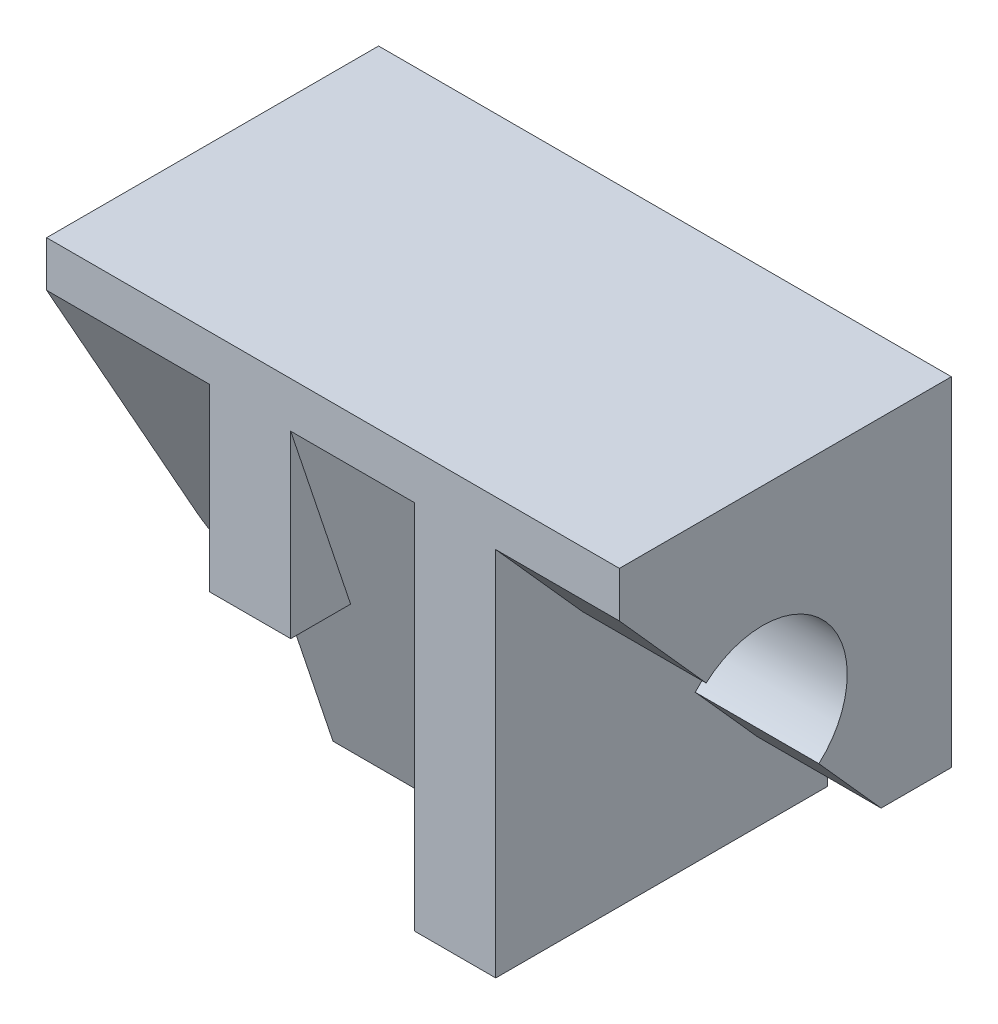
ISO-10303-21;
HEADER;
FILE_DESCRIPTION(('STEP AP214'),'2;1');
FILE_NAME('part.step','',(''),(''),'','','');
FILE_SCHEMA(('AUTOMOTIVE_DESIGN { 1 0 10303 214 1 1 1 1 }'));
ENDSEC;
DATA;
#1=APPLICATION_CONTEXT('core data for automotive mechanical design processes');
#2=APPLICATION_PROTOCOL_DEFINITION('international standard','automotive_design',2000,#1);
#3=PRODUCT_CONTEXT('',#1,'mechanical');
#4=PRODUCT('Part','Part','',(#3));
#5=PRODUCT_RELATED_PRODUCT_CATEGORY('part','',(#4));
#6=PRODUCT_DEFINITION_FORMATION('','',#4);
#7=PRODUCT_DEFINITION_CONTEXT('part definition',#1,'design');
#8=PRODUCT_DEFINITION('design','',#6,#7);
#9=PRODUCT_DEFINITION_SHAPE('','',#8);
#10=(LENGTH_UNIT() NAMED_UNIT(*) SI_UNIT(.MILLI.,.METRE.));
#11=(NAMED_UNIT(*) PLANE_ANGLE_UNIT() SI_UNIT($,.RADIAN.));
#12=(NAMED_UNIT(*) SI_UNIT($,.STERADIAN.) SOLID_ANGLE_UNIT());
#13=UNCERTAINTY_MEASURE_WITH_UNIT(LENGTH_MEASURE(1.E-05),#10,'distance_accuracy_value','');
#14=(GEOMETRIC_REPRESENTATION_CONTEXT(3) GLOBAL_UNCERTAINTY_ASSIGNED_CONTEXT((#13)) GLOBAL_UNIT_ASSIGNED_CONTEXT((#10,
#11,#12)) REPRESENTATION_CONTEXT('',''));
#15=CARTESIAN_POINT('',(0.,0.,0.));
#16=DIRECTION('',(0.,0.,1.));
#17=DIRECTION('',(1.,0.,0.));
#18=AXIS2_PLACEMENT_3D('',#15,#16,#17);
#19=CARTESIAN_POINT('',(-17.3125,2.69270833333333,25.5));
#20=DIRECTION('',(1.,0.,0.));
#21=DIRECTION('',(0.,1.,0.));
#22=AXIS2_PLACEMENT_3D('',#19,#20,#21);
#23=PLANE('',#22);
#24=DIRECTION('',(0.,-1.,0.));
#25=VECTOR('',#24,1.);
#26=CARTESIAN_POINT('',(-17.3125,2.69270833333333,0.));
#27=LINE('',#26,#25);
#28=CARTESIAN_POINT('',(-17.3125,2.69270833333333,0.));
#29=VERTEX_POINT('',#28);
#30=CARTESIAN_POINT('',(-17.3125,-21.3072916666667,0.));
#31=VERTEX_POINT('',#30);
#32=EDGE_CURVE('E173',#29,#31,#27,.T.);
#33=ORIENTED_EDGE('',*,*,#32,.T.);
#34=DIRECTION('',(0.,0.,-1.));
#35=VECTOR('',#34,1.);
#36=CARTESIAN_POINT('',(-17.3125,-21.3072916666667,25.5));
#37=LINE('',#36,#35);
#38=CARTESIAN_POINT('',(-17.3125,-21.3072916666667,13.9912280701754));
#39=VERTEX_POINT('',#38);
#40=EDGE_CURVE('E48',#31,#39,#37,.F.);
#41=ORIENTED_EDGE('',*,*,#40,.T.);
#42=DIRECTION('',(0.,0.871983785385481,0.489534756707639));
#43=VECTOR('',#42,1.);
#44=CARTESIAN_POINT('',(-17.3125,-40.1518979356792,3.41179998932631));
#45=LINE('',#44,#43);
#46=CARTESIAN_POINT('',(-17.3125,-0.80729166666667,25.5));
#47=VERTEX_POINT('',#46);
#48=EDGE_CURVE('E182',#39,#47,#45,.T.);
#49=ORIENTED_EDGE('',*,*,#48,.T.);
#50=DIRECTION('',(0.,-1.,0.));
#51=VECTOR('',#50,1.);
#52=CARTESIAN_POINT('',(-17.3125,2.69270833333333,25.5));
#53=LINE('',#52,#51);
#54=CARTESIAN_POINT('',(-17.3125,2.69270833333333,25.5));
#55=VERTEX_POINT('',#54);
#56=EDGE_CURVE('E177',#55,#47,#53,.T.);
#57=ORIENTED_EDGE('',*,*,#56,.F.);
#58=DIRECTION('',(0.,0.,-1.));
#59=VECTOR('',#58,1.);
#60=CARTESIAN_POINT('',(-17.3125,2.69270833333333,25.5));
#61=LINE('',#60,#59);
#62=EDGE_CURVE('E187',#55,#29,#61,.T.);
#63=ORIENTED_EDGE('',*,*,#62,.T.);
#64=EDGE_LOOP('',(#33,#41,#49,#57,#63));
#65=FACE_BOUND('',#64,.T.);
#66=ADVANCED_FACE('F39',(#65),#23,.F.);
#67=CARTESIAN_POINT('',(0.,0.,25.5));
#68=DIRECTION('',(0.,0.,1.));
#69=DIRECTION('',(1.,0.,0.));
#70=AXIS2_PLACEMENT_3D('',#67,#68,#69);
#71=PLANE('',#70);
#72=DIRECTION('',(0.,1.,0.));
#73=VECTOR('',#72,1.);
#74=CARTESIAN_POINT('',(-4.8125,-29.3072916666667,25.5));
#75=LINE('',#74,#73);
#76=CARTESIAN_POINT('',(-4.8125,-14.6098867790321,25.5));
#77=VERTEX_POINT('',#76);
#78=CARTESIAN_POINT('',(-4.8125,-0.80729166666667,25.5));
#79=VERTEX_POINT('',#78);
#80=EDGE_CURVE('E151',#77,#79,#75,.T.);
#81=ORIENTED_EDGE('',*,*,#80,.F.);
#82=DIRECTION('',(1.,0.,0.));
#83=VECTOR('',#82,1.);
#84=CARTESIAN_POINT('',(0.,-14.6098867790321,25.5));
#85=LINE('',#84,#83);
#86=CARTESIAN_POINT('',(1.4375,-14.6098867790321,25.5));
#87=VERTEX_POINT('',#86);
#88=EDGE_CURVE('E246',#77,#87,#85,.T.);
#89=ORIENTED_EDGE('',*,*,#88,.T.);
#90=DIRECTION('',(0.,1.,0.));
#91=VECTOR('',#90,1.);
#92=CARTESIAN_POINT('',(1.4375,0.,25.5));
#93=LINE('',#92,#91);
#94=CARTESIAN_POINT('',(1.4375,-0.80729166666667,25.5));
#95=VERTEX_POINT('',#94);
#96=EDGE_CURVE('E250',#87,#95,#93,.T.);
#97=ORIENTED_EDGE('',*,*,#96,.T.);
#98=DIRECTION('',(-1.,0.,0.));
#99=VECTOR('',#98,1.);
#100=CARTESIAN_POINT('',(0.,-0.807291666666703,25.5));
#101=LINE('',#100,#99);
#102=CARTESIAN_POINT('',(10.9375,-0.807291666666704,25.5));
#103=VERTEX_POINT('',#102);
#104=EDGE_CURVE('E261',#103,#95,#101,.T.);
#105=ORIENTED_EDGE('',*,*,#104,.F.);
#106=DIRECTION('',(0.,-1.,0.));
#107=VECTOR('',#106,1.);
#108=CARTESIAN_POINT('',(10.9375,0.,25.5));
#109=LINE('',#108,#107);
#110=CARTESIAN_POINT('',(10.9375,-29.3072916666667,25.5));
#111=VERTEX_POINT('',#110);
#112=EDGE_CURVE('E255',#103,#111,#109,.T.);
#113=ORIENTED_EDGE('',*,*,#112,.T.);
#114=DIRECTION('',(1.,0.,0.));
#115=VECTOR('',#114,1.);
#116=CARTESIAN_POINT('',(-4.8125,-29.3072916666667,25.5));
#117=LINE('',#116,#115);
#118=CARTESIAN_POINT('',(17.1875,-29.3072916666667,25.5));
#119=VERTEX_POINT('',#118);
#120=EDGE_CURVE('E287',#111,#119,#117,.T.);
#121=ORIENTED_EDGE('',*,*,#120,.T.);
#122=DIRECTION('',(0.,1.,0.));
#123=VECTOR('',#122,1.);
#124=CARTESIAN_POINT('',(17.1875,2.69270833333333,25.5));
#125=LINE('',#124,#123);
#126=CARTESIAN_POINT('',(17.1875,-0.807291666666666,25.5));
#127=VERTEX_POINT('',#126);
#128=EDGE_CURVE('E290',#119,#127,#125,.T.);
#129=ORIENTED_EDGE('',*,*,#128,.T.);
#130=DIRECTION('',(1.,0.,0.));
#131=VECTOR('',#130,1.);
#132=CARTESIAN_POINT('',(17.1875,-0.807291666666666,25.5));
#133=LINE('',#132,#131);
#134=CARTESIAN_POINT('',(26.6875,-0.807291666666665,25.5));
#135=VERTEX_POINT('',#134);
#136=EDGE_CURVE('E214',#127,#135,#133,.T.);
#137=ORIENTED_EDGE('',*,*,#136,.T.);
#138=DIRECTION('',(0.,1.,0.));
#139=VECTOR('',#138,1.);
#140=CARTESIAN_POINT('',(26.6875,2.69270833333333,25.5));
#141=LINE('',#140,#139);
#142=CARTESIAN_POINT('',(26.6875,2.69270833333333,25.5));
#143=VERTEX_POINT('',#142);
#144=EDGE_CURVE('E225',#135,#143,#141,.T.);
#145=ORIENTED_EDGE('',*,*,#144,.T.);
#146=DIRECTION('',(-1.,0.,0.));
#147=VECTOR('',#146,1.);
#148=CARTESIAN_POINT('',(-4.81250000000001,2.69270833333333,25.5));
#149=LINE('',#148,#147);
#150=EDGE_CURVE('E294',#143,#55,#149,.T.);
#151=ORIENTED_EDGE('',*,*,#150,.T.);
#152=ORIENTED_EDGE('',*,*,#56,.T.);
#153=DIRECTION('',(-1.,0.,0.));
#154=VECTOR('',#153,1.);
#155=CARTESIAN_POINT('',(-4.8125,-0.80729166666667,25.5));
#156=LINE('',#155,#154);
#157=EDGE_CURVE('E163',#79,#47,#156,.T.);
#158=ORIENTED_EDGE('',*,*,#157,.F.);
#159=EDGE_LOOP('',(#81,#89,#97,#105,#113,#121,#129,#137,#145,#151,#152,#158));
#160=FACE_BOUND('',#159,.T.);
#161=ADVANCED_FACE('F175',(#160),#71,.T.);
#162=CARTESIAN_POINT('',(17.1875,-23.3072916666667,25.5));
#163=DIRECTION('',(0.,1.,0.));
#164=DIRECTION('',(0.,0.,1.));
#165=AXIS2_PLACEMENT_3D('',#162,#163,#164);
#166=PLANE('',#165);
#167=DIRECTION('',(1.,0.,0.));
#168=VECTOR('',#167,1.);
#169=CARTESIAN_POINT('',(17.1875,-23.3072916666667,5.39999999999999));
#170=LINE('',#169,#168);
#171=CARTESIAN_POINT('',(17.1875,-23.3072916666667,5.39999999999999));
#172=VERTEX_POINT('',#171);
#173=CARTESIAN_POINT('',(26.6875,-23.3072916666667,5.39999999999999));
#174=VERTEX_POINT('',#173);
#175=EDGE_CURVE('E210',#172,#174,#170,.T.);
#176=ORIENTED_EDGE('',*,*,#175,.F.);
#177=DIRECTION('',(0.,0.,-1.));
#178=VECTOR('',#177,1.);
#179=CARTESIAN_POINT('',(17.1875,-23.3072916666667,25.5));
#180=LINE('',#179,#178);
#181=CARTESIAN_POINT('',(17.1875,-23.3072916666667,0.));
#182=VERTEX_POINT('',#181);
#183=EDGE_CURVE('E242',#172,#182,#180,.T.);
#184=ORIENTED_EDGE('',*,*,#183,.T.);
#185=DIRECTION('',(1.,0.,0.));
#186=VECTOR('',#185,1.);
#187=CARTESIAN_POINT('',(17.1875,-23.3072916666667,0.));
#188=LINE('',#187,#186);
#189=CARTESIAN_POINT('',(26.6875,-23.3072916666667,0.));
#190=VERTEX_POINT('',#189);
#191=EDGE_CURVE('E213',#182,#190,#188,.T.);
#192=ORIENTED_EDGE('',*,*,#191,.T.);
#193=DIRECTION('',(0.,0.,-1.));
#194=VECTOR('',#193,1.);
#195=CARTESIAN_POINT('',(26.6875,-23.3072916666667,25.5));
#196=LINE('',#195,#194);
#197=EDGE_CURVE('E239',#174,#190,#196,.T.);
#198=ORIENTED_EDGE('',*,*,#197,.F.);
#199=EDGE_LOOP('',(#176,#184,#192,#198));
#200=FACE_BOUND('',#199,.T.);
#201=ADVANCED_FACE('F368',(#200),#166,.F.);
#202=CARTESIAN_POINT('',(26.6875,2.69270833333333,25.5));
#203=DIRECTION('',(-1.,0.,0.));
#204=DIRECTION('',(0.,-1.,0.));
#205=AXIS2_PLACEMENT_3D('',#202,#203,#204);
#206=PLANE('',#205);
#207=DIRECTION('',(0.,-0.745761207441643,-0.666213345314534));
#208=VECTOR('',#207,1.);
#209=CARTESIAN_POINT('',(26.6875,-13.0276282669237,14.583165970437));
#210=LINE('',#209,#208);
#211=CARTESIAN_POINT('',(26.6875,-17.9606969535699,10.1762912770331));
#212=VERTEX_POINT('',#211);
#213=EDGE_CURVE('E193',#212,#174,#210,.T.);
#214=ORIENTED_EDGE('',*,*,#213,.T.);
#215=ORIENTED_EDGE('',*,*,#197,.T.);
#216=DIRECTION('',(0.,1.,0.));
#217=VECTOR('',#216,1.);
#218=CARTESIAN_POINT('',(26.6875,2.69270833333333,0.));
#219=LINE('',#218,#217);
#220=CARTESIAN_POINT('',(26.6875,2.69270833333333,0.));
#221=VERTEX_POINT('',#220);
#222=EDGE_CURVE('E229',#190,#221,#219,.T.);
#223=ORIENTED_EDGE('',*,*,#222,.T.);
#224=DIRECTION('',(0.,0.,-1.));
#225=VECTOR('',#224,1.);
#226=CARTESIAN_POINT('',(26.6875,2.69270833333333,25.5));
#227=LINE('',#226,#225);
#228=EDGE_CURVE('E228',#143,#221,#227,.T.);
#229=ORIENTED_EDGE('',*,*,#228,.F.);
#230=ORIENTED_EDGE('',*,*,#144,.F.);
#231=CARTESIAN_POINT('',(26.6875,-8.26581044541502,18.8370565576515));
#232=VERTEX_POINT('',#231);
#233=EDGE_CURVE('E198',#135,#232,#210,.T.);
#234=ORIENTED_EDGE('',*,*,#233,.T.);
#235=CARTESIAN_POINT('',(26.6875,-13.1072916666667,14.5));
#236=DIRECTION('',(1.,0.,0.));
#237=DIRECTION('',(0.,1.,0.));
#238=AXIS2_PLACEMENT_3D('',#235,#236,#237);
#239=CIRCLE('',#238,6.5);
#240=EDGE_CURVE('E206',#212,#232,#239,.T.);
#241=ORIENTED_EDGE('',*,*,#240,.F.);
#242=EDGE_LOOP('',(#214,#215,#223,#229,#230,#234,#241));
#243=FACE_BOUND('',#242,.T.);
#244=ADVANCED_FACE('F382',(#243),#206,.F.);
#245=CARTESIAN_POINT('',(17.1875,2.69270833333333,25.5));
#246=DIRECTION('',(-1.,0.,0.));
#247=DIRECTION('',(0.,-1.,0.));
#248=AXIS2_PLACEMENT_3D('',#245,#246,#247);
#249=PLANE('',#248);
#250=ORIENTED_EDGE('',*,*,#183,.F.);
#251=DIRECTION('',(0.,-0.745761207441643,-0.666213345314534));
#252=VECTOR('',#251,1.);
#253=CARTESIAN_POINT('',(17.1875,-13.0276282669237,14.583165970437));
#254=LINE('',#253,#252);
#255=CARTESIAN_POINT('',(17.1875,-17.9606969535699,10.1762912770331));
#256=VERTEX_POINT('',#255);
#257=EDGE_CURVE('E194',#256,#172,#254,.T.);
#258=ORIENTED_EDGE('',*,*,#257,.F.);
#259=CARTESIAN_POINT('',(17.1875,-13.1072916666667,14.5));
#260=DIRECTION('',(1.,0.,0.));
#261=DIRECTION('',(0.,1.,0.));
#262=AXIS2_PLACEMENT_3D('',#259,#260,#261);
#263=CIRCLE('',#262,6.5);
#264=CARTESIAN_POINT('',(17.1875,-8.26581044541502,18.8370565576515));
#265=VERTEX_POINT('',#264);
#266=EDGE_CURVE('E197',#256,#265,#263,.T.);
#267=ORIENTED_EDGE('',*,*,#266,.T.);
#268=EDGE_CURVE('E199',#127,#265,#254,.T.);
#269=ORIENTED_EDGE('',*,*,#268,.F.);
#270=ORIENTED_EDGE('',*,*,#128,.F.);
#271=DIRECTION('',(0.,0.,-1.));
#272=VECTOR('',#271,1.);
#273=CARTESIAN_POINT('',(17.1875,-29.3072916666667,25.5));
#274=LINE('',#273,#272);
#275=CARTESIAN_POINT('',(17.1875,-29.3072916666667,0.));
#276=VERTEX_POINT('',#275);
#277=EDGE_CURVE('E297',#119,#276,#274,.T.);
#278=ORIENTED_EDGE('',*,*,#277,.T.);
#279=DIRECTION('',(0.,1.,0.));
#280=VECTOR('',#279,1.);
#281=CARTESIAN_POINT('',(17.1875,2.69270833333333,0.));
#282=LINE('',#281,#280);
#283=EDGE_CURVE('E300',#276,#182,#282,.T.);
#284=ORIENTED_EDGE('',*,*,#283,.T.);
#285=EDGE_LOOP('',(#250,#258,#267,#269,#270,#278,#284));
#286=FACE_BOUND('',#285,.T.);
#287=ADVANCED_FACE('F334',(#286),#249,.F.);
#288=CARTESIAN_POINT('',(-4.8125,-29.3072916666667,25.5));
#289=DIRECTION('',(0.,1.,0.));
#290=DIRECTION('',(0.,0.,1.));
#291=AXIS2_PLACEMENT_3D('',#288,#289,#290);
#292=PLANE('',#291);
#293=DIRECTION('',(-1.,0.,0.));
#294=VECTOR('',#293,1.);
#295=CARTESIAN_POINT('',(-4.8125,-29.3072916666667,9.49999999999999));
#296=LINE('',#295,#294);
#297=CARTESIAN_POINT('',(-4.8125,-29.3072916666667,9.49999999999999));
#298=VERTEX_POINT('',#297);
#299=CARTESIAN_POINT('',(-9.3125,-29.3072916666667,9.49999999999999));
#300=VERTEX_POINT('',#299);
#301=EDGE_CURVE('E170',#298,#300,#296,.T.);
#302=ORIENTED_EDGE('',*,*,#301,.T.);
#303=DIRECTION('',(0.,0.,-1.));
#304=VECTOR('',#303,1.);
#305=CARTESIAN_POINT('',(-9.3125,-29.3072916666667,25.5));
#306=LINE('',#305,#304);
#307=CARTESIAN_POINT('',(-9.3125,-29.3072916666667,0.));
#308=VERTEX_POINT('',#307);
#309=EDGE_CURVE('E309',#300,#308,#306,.T.);
#310=ORIENTED_EDGE('',*,*,#309,.T.);
#311=DIRECTION('',(1.,0.,0.));
#312=VECTOR('',#311,1.);
#313=CARTESIAN_POINT('',(-4.8125,-29.3072916666667,0.));
#314=LINE('',#313,#312);
#315=EDGE_CURVE('E259',#308,#276,#314,.T.);
#316=ORIENTED_EDGE('',*,*,#315,.T.);
#317=ORIENTED_EDGE('',*,*,#277,.F.);
#318=ORIENTED_EDGE('',*,*,#120,.F.);
#319=DIRECTION('',(0.,0.,1.));
#320=VECTOR('',#319,1.);
#321=CARTESIAN_POINT('',(10.9375,-29.3072916666667,-12.6931327817518));
#322=LINE('',#321,#320);
#323=CARTESIAN_POINT('',(10.9375,-29.3072916666667,16.));
#324=VERTEX_POINT('',#323);
#325=EDGE_CURVE('E260',#324,#111,#322,.T.);
#326=ORIENTED_EDGE('',*,*,#325,.F.);
#327=DIRECTION('',(1.,0.,0.));
#328=VECTOR('',#327,1.);
#329=CARTESIAN_POINT('',(0.,-29.3072916666667,16.));
#330=LINE('',#329,#328);
#331=CARTESIAN_POINT('',(-4.8125,-29.3072916666667,16.));
#332=VERTEX_POINT('',#331);
#333=EDGE_CURVE('E275',#332,#324,#330,.T.);
#334=ORIENTED_EDGE('',*,*,#333,.F.);
#335=DIRECTION('',(0.,0.,1.));
#336=VECTOR('',#335,1.);
#337=CARTESIAN_POINT('',(-4.8125,-29.3072916666667,-15.9051549273522));
#338=LINE('',#337,#336);
#339=EDGE_CURVE('E179',#298,#332,#338,.T.);
#340=ORIENTED_EDGE('',*,*,#339,.F.);
#341=EDGE_LOOP('',(#302,#310,#316,#317,#318,#326,#334,#340));
#342=FACE_BOUND('',#341,.T.);
#343=ADVANCED_FACE('F326',(#342),#292,.F.);
#344=CARTESIAN_POINT('',(-4.81250000000001,2.69270833333333,25.5));
#345=DIRECTION('',(0.,-1.,0.));
#346=DIRECTION('',(0.,0.,-1.));
#347=AXIS2_PLACEMENT_3D('',#344,#345,#346);
#348=PLANE('',#347);
#349=DIRECTION('',(-1.,0.,0.));
#350=VECTOR('',#349,1.);
#351=CARTESIAN_POINT('',(-4.81250000000001,2.69270833333333,0.));
#352=LINE('',#351,#350);
#353=EDGE_CURVE('E291',#221,#29,#352,.T.);
#354=ORIENTED_EDGE('',*,*,#353,.T.);
#355=ORIENTED_EDGE('',*,*,#62,.F.);
#356=ORIENTED_EDGE('',*,*,#150,.F.);
#357=ORIENTED_EDGE('',*,*,#228,.T.);
#358=EDGE_LOOP('',(#354,#355,#356,#357));
#359=FACE_BOUND('',#358,.T.);
#360=ADVANCED_FACE('F406',(#359),#348,.F.);
#361=CARTESIAN_POINT('',(0.,0.,0.));
#362=DIRECTION('',(0.,0.,1.));
#363=DIRECTION('',(1.,0.,0.));
#364=AXIS2_PLACEMENT_3D('',#361,#362,#363);
#365=PLANE('',#364);
#366=ORIENTED_EDGE('',*,*,#315,.F.);
#367=CARTESIAN_POINT('',(-9.3125,-21.3072916666667,0.));
#368=DIRECTION('',(0.,0.,1.));
#369=DIRECTION('',(1.,0.,0.));
#370=AXIS2_PLACEMENT_3D('',#367,#368,#369);
#371=CIRCLE('',#370,8.);
#372=EDGE_CURVE('E62',#308,#31,#371,.F.);
#373=ORIENTED_EDGE('',*,*,#372,.T.);
#374=ORIENTED_EDGE('',*,*,#32,.F.);
#375=ORIENTED_EDGE('',*,*,#353,.F.);
#376=ORIENTED_EDGE('',*,*,#222,.F.);
#377=ORIENTED_EDGE('',*,*,#191,.F.);
#378=ORIENTED_EDGE('',*,*,#283,.F.);
#379=EDGE_LOOP('',(#366,#373,#374,#375,#376,#377,#378));
#380=FACE_BOUND('',#379,.T.);
#381=ADVANCED_FACE('F329',(#380),#365,.F.);
#382=CARTESIAN_POINT('',(0.,-7.73072916666667,23.1921875));
#383=DIRECTION('',(0.,0.316227766016838,-0.948683298050514));
#384=DIRECTION('',(0.,0.948683298050514,0.316227766016838));
#385=AXIS2_PLACEMENT_3D('',#382,#383,#384);
#386=PLANE('',#385);
#387=ORIENTED_EDGE('',*,*,#104,.T.);
#388=DIRECTION('',(0.,0.948683298050514,0.316227766016838));
#389=VECTOR('',#388,1.);
#390=CARTESIAN_POINT('',(1.4375,-11.5386690011922,21.9228742218248));
#391=LINE('',#390,#389);
#392=CARTESIAN_POINT('',(1.4375,-14.6098867790321,20.8991349625449));
#393=VERTEX_POINT('',#392);
#394=EDGE_CURVE('E264',#393,#95,#391,.T.);
#395=ORIENTED_EDGE('',*,*,#394,.F.);
#396=DIRECTION('',(1.,0.,0.));
#397=VECTOR('',#396,1.);
#398=CARTESIAN_POINT('',(0.,-14.6098867790321,20.8991349625449));
#399=LINE('',#398,#397);
#400=CARTESIAN_POINT('',(-4.8125,-14.6098867790321,20.8991349625449));
#401=VERTEX_POINT('',#400);
#402=EDGE_CURVE('E268',#401,#393,#399,.T.);
#403=ORIENTED_EDGE('',*,*,#402,.F.);
#404=DIRECTION('',(0.,-0.948683298050514,-0.316227766016838));
#405=VECTOR('',#404,1.);
#406=CARTESIAN_POINT('',(-4.8125,-11.5386690011922,21.9228742218248));
#407=LINE('',#406,#405);
#408=EDGE_CURVE('E249',#401,#332,#407,.T.);
#409=ORIENTED_EDGE('',*,*,#408,.T.);
#410=ORIENTED_EDGE('',*,*,#333,.T.);
#411=DIRECTION('',(0.,-0.948683298050514,-0.316227766016838));
#412=VECTOR('',#411,1.);
#413=CARTESIAN_POINT('',(10.9375,-11.5386690011922,21.9228742218248));
#414=LINE('',#413,#412);
#415=EDGE_CURVE('E245',#103,#324,#414,.T.);
#416=ORIENTED_EDGE('',*,*,#415,.F.);
#417=EDGE_LOOP('',(#387,#395,#403,#409,#410,#416));
#418=FACE_BOUND('',#417,.T.);
#419=ADVANCED_FACE('F347',(#418),#386,.F.);
#420=CARTESIAN_POINT('',(1.4375,0.,-12.6931327817518));
#421=DIRECTION('',(1.,0.,0.));
#422=DIRECTION('',(0.,0.,-1.));
#423=AXIS2_PLACEMENT_3D('',#420,#421,#422);
#424=PLANE('',#423);
#425=ORIENTED_EDGE('',*,*,#394,.T.);
#426=ORIENTED_EDGE('',*,*,#96,.F.);
#427=DIRECTION('',(0.,0.,1.));
#428=VECTOR('',#427,1.);
#429=CARTESIAN_POINT('',(1.4375,-14.6098867790321,-12.6931327817518));
#430=LINE('',#429,#428);
#431=EDGE_CURVE('E254',#393,#87,#430,.T.);
#432=ORIENTED_EDGE('',*,*,#431,.F.);
#433=EDGE_LOOP('',(#425,#426,#432));
#434=FACE_BOUND('',#433,.T.);
#435=ADVANCED_FACE('F354',(#434),#424,.T.);
#436=CARTESIAN_POINT('',(0.,-14.6098867790321,-12.6931327817518));
#437=DIRECTION('',(0.,-1.,0.));
#438=DIRECTION('',(0.,0.,-1.));
#439=AXIS2_PLACEMENT_3D('',#436,#437,#438);
#440=PLANE('',#439);
#441=ORIENTED_EDGE('',*,*,#402,.T.);
#442=ORIENTED_EDGE('',*,*,#431,.T.);
#443=ORIENTED_EDGE('',*,*,#88,.F.);
#444=DIRECTION('',(0.,0.,1.));
#445=VECTOR('',#444,1.);
#446=CARTESIAN_POINT('',(-4.8125,-14.6098867790321,-12.6931327817518));
#447=LINE('',#446,#445);
#448=EDGE_CURVE('E157',#401,#77,#447,.T.);
#449=ORIENTED_EDGE('',*,*,#448,.F.);
#450=EDGE_LOOP('',(#441,#442,#443,#449));
#451=FACE_BOUND('',#450,.T.);
#452=ADVANCED_FACE('F351',(#451),#440,.T.);
#453=CARTESIAN_POINT('',(10.9375,0.,-12.6931327817518));
#454=DIRECTION('',(-1.,0.,0.));
#455=DIRECTION('',(0.,-1.,0.));
#456=AXIS2_PLACEMENT_3D('',#453,#454,#455);
#457=PLANE('',#456);
#458=ORIENTED_EDGE('',*,*,#415,.T.);
#459=ORIENTED_EDGE('',*,*,#325,.T.);
#460=ORIENTED_EDGE('',*,*,#112,.F.);
#461=EDGE_LOOP('',(#458,#459,#460));
#462=FACE_BOUND('',#461,.T.);
#463=ADVANCED_FACE('F345',(#462),#457,.T.);
#464=CARTESIAN_POINT('',(17.1875,-13.0276282669237,14.583165970437));
#465=DIRECTION('',(0.,-0.666213345314534,0.745761207441643));
#466=DIRECTION('',(0.,-0.745761207441643,-0.666213345314534));
#467=AXIS2_PLACEMENT_3D('',#464,#465,#466);
#468=PLANE('',#467);
#469=ORIENTED_EDGE('',*,*,#213,.F.);
#470=DIRECTION('',(1.,0.,0.));
#471=VECTOR('',#470,1.);
#472=CARTESIAN_POINT('',(17.1875,-17.9606969535699,10.1762912770331));
#473=LINE('',#472,#471);
#474=EDGE_CURVE('E221',#256,#212,#473,.T.);
#475=ORIENTED_EDGE('',*,*,#474,.F.);
#476=ORIENTED_EDGE('',*,*,#257,.T.);
#477=ORIENTED_EDGE('',*,*,#175,.T.);
#478=EDGE_LOOP('',(#469,#475,#476,#477));
#479=FACE_BOUND('',#478,.T.);
#480=ADVANCED_FACE('F377',(#479),#468,.T.);
#481=ORIENTED_EDGE('',*,*,#233,.F.);
#482=ORIENTED_EDGE('',*,*,#136,.F.);
#483=ORIENTED_EDGE('',*,*,#268,.T.);
#484=DIRECTION('',(1.,0.,0.));
#485=VECTOR('',#484,1.);
#486=CARTESIAN_POINT('',(17.1875,-8.26581044541502,18.8370565576515));
#487=LINE('',#486,#485);
#488=EDGE_CURVE('E218',#265,#232,#487,.T.);
#489=ORIENTED_EDGE('',*,*,#488,.T.);
#490=EDGE_LOOP('',(#481,#482,#483,#489));
#491=FACE_BOUND('',#490,.T.);
#492=ADVANCED_FACE('F373',(#491),#468,.T.);
#493=CARTESIAN_POINT('',(17.1875,-13.1072916666667,14.5));
#494=DIRECTION('',(1.,0.,0.));
#495=DIRECTION('',(0.,1.,0.));
#496=AXIS2_PLACEMENT_3D('',#493,#494,#495);
#497=CYLINDRICAL_SURFACE('',#496,6.5);
#498=ORIENTED_EDGE('',*,*,#240,.T.);
#499=ORIENTED_EDGE('',*,*,#488,.F.);
#500=ORIENTED_EDGE('',*,*,#266,.F.);
#501=ORIENTED_EDGE('',*,*,#474,.T.);
#502=EDGE_LOOP('',(#498,#499,#500,#501));
#503=FACE_BOUND('',#502,.T.);
#504=ADVANCED_FACE('F376',(#503),#497,.F.);
#505=CARTESIAN_POINT('',(-4.8125,-29.3072916666667,-15.9051549273522));
#506=DIRECTION('',(1.,0.,0.));
#507=DIRECTION('',(0.,0.,-1.));
#508=AXIS2_PLACEMENT_3D('',#505,#506,#507);
#509=PLANE('',#508);
#510=ORIENTED_EDGE('',*,*,#448,.T.);
#511=ORIENTED_EDGE('',*,*,#80,.T.);
#512=DIRECTION('',(0.,-0.871983785385481,-0.489534756707639));
#513=VECTOR('',#512,1.);
#514=CARTESIAN_POINT('',(-4.8125,-40.1518979356792,3.41179998932631));
#515=LINE('',#514,#513);
#516=EDGE_CURVE('E154',#79,#298,#515,.T.);
#517=ORIENTED_EDGE('',*,*,#516,.T.);
#518=ORIENTED_EDGE('',*,*,#339,.T.);
#519=ORIENTED_EDGE('',*,*,#408,.F.);
#520=EDGE_LOOP('',(#510,#511,#517,#518,#519));
#521=FACE_BOUND('',#520,.T.);
#522=ADVANCED_FACE('F153',(#521),#509,.F.);
#523=CARTESIAN_POINT('',(0.,-11.0785552695218,19.7336765738357));
#524=DIRECTION('',(0.,-0.489534756707639,0.871983785385481));
#525=DIRECTION('',(0.,-0.871983785385481,-0.489534756707639));
#526=AXIS2_PLACEMENT_3D('',#523,#524,#525);
#527=PLANE('',#526);
#528=ORIENTED_EDGE('',*,*,#48,.F.);
#529=CARTESIAN_POINT('',(-9.3125,-21.3072916666667,13.9912280701754));
#530=DIRECTION('',(0.,-0.489534756707639,0.871983785385481));
#531=DIRECTION('',(0.,-0.871983785385481,-0.489534756707639));
#532=AXIS2_PLACEMENT_3D('',#529,#530,#531);
#533=ELLIPSE('',#532,9.1744825237357,8.);
#534=EDGE_CURVE('E11',#39,#300,#533,.T.);
#535=ORIENTED_EDGE('',*,*,#534,.T.);
#536=ORIENTED_EDGE('',*,*,#301,.F.);
#537=ORIENTED_EDGE('',*,*,#516,.F.);
#538=ORIENTED_EDGE('',*,*,#157,.T.);
#539=EDGE_LOOP('',(#528,#535,#536,#537,#538));
#540=FACE_BOUND('',#539,.T.);
#541=ADVANCED_FACE('F167',(#540),#527,.T.);
#542=CARTESIAN_POINT('',(-9.3125,-21.3072916666667,25.5));
#543=DIRECTION('',(0.,0.,-1.));
#544=DIRECTION('',(-1.,0.,0.));
#545=AXIS2_PLACEMENT_3D('',#542,#543,#544);
#546=CYLINDRICAL_SURFACE('',#545,8.);
#547=ORIENTED_EDGE('',*,*,#534,.F.);
#548=ORIENTED_EDGE('',*,*,#40,.F.);
#549=ORIENTED_EDGE('',*,*,#372,.F.);
#550=ORIENTED_EDGE('',*,*,#309,.F.);
#551=EDGE_LOOP('',(#547,#548,#549,#550));
#552=FACE_BOUND('',#551,.T.);
#553=ADVANCED_FACE('F41',(#552),#546,.T.);
#554=CLOSED_SHELL('',(#66,#161,#201,#244,#287,#343,#360,#381,#419,#435,#452,#463,#480,#492,#504,
#522,#541,#553));
#555=MANIFOLD_SOLID_BREP('B2',#554);
#556=ADVANCED_BREP_SHAPE_REPRESENTATION('',(#18,#555),#14);
#557=SHAPE_DEFINITION_REPRESENTATION(#9,#556);
ENDSEC;
END-ISO-10303-21;
